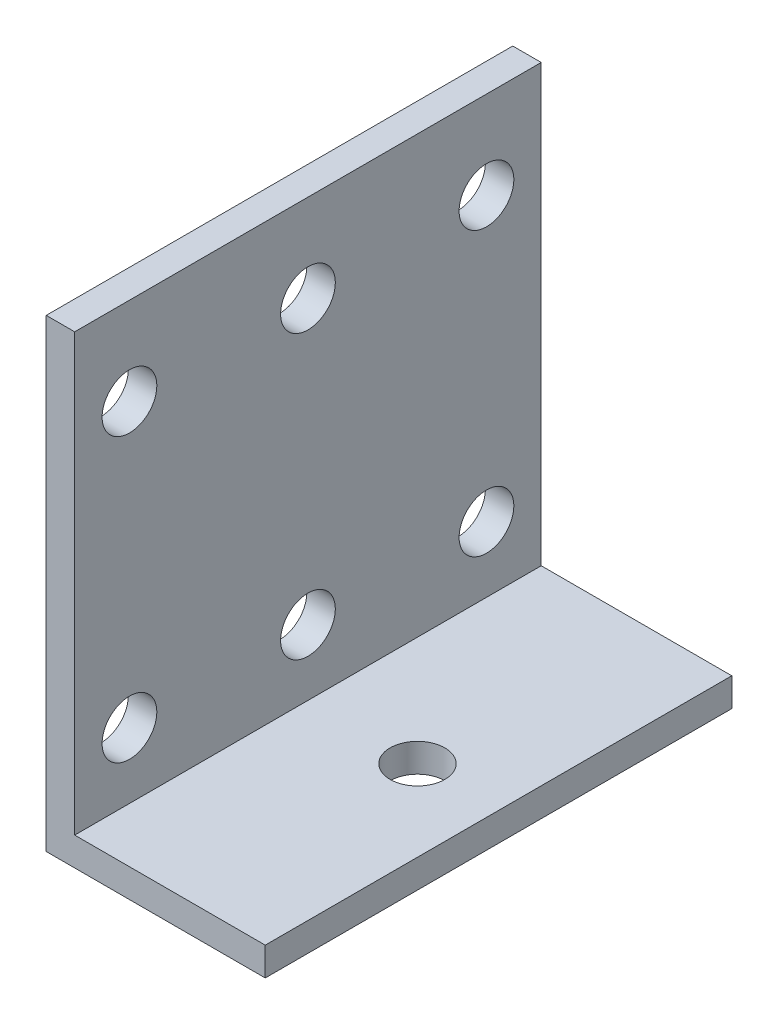
ISO-10303-21;
HEADER;
FILE_DESCRIPTION(('STEP AP214'),'2;1');
FILE_NAME('part.step','',(''),(''),'','','');
FILE_SCHEMA(('AUTOMOTIVE_DESIGN { 1 0 10303 214 1 1 1 1 }'));
ENDSEC;
DATA;
#1=APPLICATION_CONTEXT('core data for automotive mechanical design processes');
#2=APPLICATION_PROTOCOL_DEFINITION('international standard','automotive_design',2000,#1);
#3=PRODUCT_CONTEXT('',#1,'mechanical');
#4=PRODUCT('Part','Part','',(#3));
#5=PRODUCT_RELATED_PRODUCT_CATEGORY('part','',(#4));
#6=PRODUCT_DEFINITION_FORMATION('','',#4);
#7=PRODUCT_DEFINITION_CONTEXT('part definition',#1,'design');
#8=PRODUCT_DEFINITION('design','',#6,#7);
#9=PRODUCT_DEFINITION_SHAPE('','',#8);
#10=(LENGTH_UNIT() NAMED_UNIT(*) SI_UNIT(.MILLI.,.METRE.));
#11=(NAMED_UNIT(*) PLANE_ANGLE_UNIT() SI_UNIT($,.RADIAN.));
#12=(NAMED_UNIT(*) SI_UNIT($,.STERADIAN.) SOLID_ANGLE_UNIT());
#13=UNCERTAINTY_MEASURE_WITH_UNIT(LENGTH_MEASURE(1.E-05),#10,'distance_accuracy_value','');
#14=(GEOMETRIC_REPRESENTATION_CONTEXT(3) GLOBAL_UNCERTAINTY_ASSIGNED_CONTEXT((#13)) GLOBAL_UNIT_ASSIGNED_CONTEXT((#10,
#11,#12)) REPRESENTATION_CONTEXT('',''));
#15=CARTESIAN_POINT('',(0.,0.,0.));
#16=DIRECTION('',(0.,0.,1.));
#17=DIRECTION('',(1.,0.,0.));
#18=AXIS2_PLACEMENT_3D('',#15,#16,#17);
#19=CARTESIAN_POINT('',(12.7,3.302,27.051));
#20=DIRECTION('',(-1.,0.,0.));
#21=DIRECTION('',(0.,0.,1.));
#22=AXIS2_PLACEMENT_3D('',#19,#20,#21);
#23=PLANE('',#22);
#24=DIRECTION('',(0.,0.,-1.));
#25=VECTOR('',#24,1.);
#26=CARTESIAN_POINT('',(12.7,0.,27.051));
#27=LINE('',#26,#25);
#28=CARTESIAN_POINT('',(12.7,0.,27.051));
#29=VERTEX_POINT('',#28);
#30=CARTESIAN_POINT('',(12.7,0.,-27.051));
#31=VERTEX_POINT('',#30);
#32=EDGE_CURVE('E104',#29,#31,#27,.T.);
#33=ORIENTED_EDGE('',*,*,#32,.T.);
#34=DIRECTION('',(0.,-1.,0.));
#35=VECTOR('',#34,1.);
#36=CARTESIAN_POINT('',(12.7,3.302,-27.051));
#37=LINE('',#36,#35);
#38=CARTESIAN_POINT('',(12.7,3.302,-27.051));
#39=VERTEX_POINT('',#38);
#40=EDGE_CURVE('E11',#39,#31,#37,.T.);
#41=ORIENTED_EDGE('',*,*,#40,.F.);
#42=DIRECTION('',(0.,0.,-1.));
#43=VECTOR('',#42,1.);
#44=CARTESIAN_POINT('',(12.7,3.302,27.051));
#45=LINE('',#44,#43);
#46=CARTESIAN_POINT('',(12.7,3.302,27.051));
#47=VERTEX_POINT('',#46);
#48=EDGE_CURVE('E98',#47,#39,#45,.T.);
#49=ORIENTED_EDGE('',*,*,#48,.F.);
#50=DIRECTION('',(0.,-1.,0.));
#51=VECTOR('',#50,1.);
#52=CARTESIAN_POINT('',(12.7,3.302,27.051));
#53=LINE('',#52,#51);
#54=EDGE_CURVE('E89',#47,#29,#53,.T.);
#55=ORIENTED_EDGE('',*,*,#54,.T.);
#56=EDGE_LOOP('',(#33,#41,#49,#55));
#57=FACE_BOUND('',#56,.T.);
#58=ADVANCED_FACE('F43',(#57),#23,.F.);
#59=CARTESIAN_POINT('',(-12.7,3.302,-27.051));
#60=DIRECTION('',(0.,0.,1.));
#61=DIRECTION('',(1.,0.,0.));
#62=AXIS2_PLACEMENT_3D('',#59,#60,#61);
#63=PLANE('',#62);
#64=DIRECTION('',(-1.,0.,0.));
#65=VECTOR('',#64,1.);
#66=CARTESIAN_POINT('',(-12.7,0.,-27.051));
#67=LINE('',#66,#65);
#68=CARTESIAN_POINT('',(-12.7,0.,-27.051));
#69=VERTEX_POINT('',#68);
#70=EDGE_CURVE('E108',#31,#69,#67,.T.);
#71=ORIENTED_EDGE('',*,*,#70,.T.);
#72=DIRECTION('',(0.,-1.,0.));
#73=VECTOR('',#72,1.);
#74=CARTESIAN_POINT('',(-12.7,3.302,-27.051));
#75=LINE('',#74,#73);
#76=CARTESIAN_POINT('',(-12.7,53.848,-27.051));
#77=VERTEX_POINT('',#76);
#78=EDGE_CURVE('E51',#77,#69,#75,.T.);
#79=ORIENTED_EDGE('',*,*,#78,.F.);
#80=DIRECTION('',(1.,0.,0.));
#81=VECTOR('',#80,1.);
#82=CARTESIAN_POINT('',(-12.7,53.848,-27.051));
#83=LINE('',#82,#81);
#84=CARTESIAN_POINT('',(-9.398,53.848,-27.051));
#85=VERTEX_POINT('',#84);
#86=EDGE_CURVE('E136',#77,#85,#83,.T.);
#87=ORIENTED_EDGE('',*,*,#86,.T.);
#88=DIRECTION('',(0.,-1.,0.));
#89=VECTOR('',#88,1.);
#90=CARTESIAN_POINT('',(-9.398,53.848,-27.051));
#91=LINE('',#90,#89);
#92=CARTESIAN_POINT('',(-9.398,3.302,-27.051));
#93=VERTEX_POINT('',#92);
#94=EDGE_CURVE('E114',#85,#93,#91,.T.);
#95=ORIENTED_EDGE('',*,*,#94,.T.);
#96=DIRECTION('',(-1.,0.,0.));
#97=VECTOR('',#96,1.);
#98=CARTESIAN_POINT('',(-12.7,3.302,-27.051));
#99=LINE('',#98,#97);
#100=EDGE_CURVE('E169',#39,#93,#99,.T.);
#101=ORIENTED_EDGE('',*,*,#100,.F.);
#102=ORIENTED_EDGE('',*,*,#40,.T.);
#103=EDGE_LOOP('',(#71,#79,#87,#95,#101,#102));
#104=FACE_BOUND('',#103,.T.);
#105=ADVANCED_FACE('F133',(#104),#63,.F.);
#106=CARTESIAN_POINT('',(-12.7,3.302,27.051));
#107=DIRECTION('',(1.,0.,0.));
#108=DIRECTION('',(0.,0.,-1.));
#109=AXIS2_PLACEMENT_3D('',#106,#107,#108);
#110=PLANE('',#109);
#111=CARTESIAN_POINT('',(-12.7,43.6857297948952,20.701));
#112=DIRECTION('',(1.,0.,0.));
#113=DIRECTION('',(0.,0.,-1.));
#114=AXIS2_PLACEMENT_3D('',#111,#112,#113);
#115=CIRCLE('',#114,3.175);
#116=CARTESIAN_POINT('',(-12.7,43.6857297948952,17.526));
#117=VERTEX_POINT('',#116);
#118=EDGE_CURVE('E200',#117,#117,#115,.T.);
#119=ORIENTED_EDGE('',*,*,#118,.T.);
#120=EDGE_LOOP('',(#119));
#121=FACE_BOUND('',#120,.T.);
#122=CARTESIAN_POINT('',(-12.7,43.6857297948952,0.));
#123=DIRECTION('',(1.,0.,0.));
#124=DIRECTION('',(0.,0.,-1.));
#125=AXIS2_PLACEMENT_3D('',#122,#123,#124);
#126=CIRCLE('',#125,3.175);
#127=CARTESIAN_POINT('',(-12.7,43.6857297948952,-3.175));
#128=VERTEX_POINT('',#127);
#129=EDGE_CURVE('E204',#128,#128,#126,.T.);
#130=ORIENTED_EDGE('',*,*,#129,.T.);
#131=EDGE_LOOP('',(#130));
#132=FACE_BOUND('',#131,.T.);
#133=CARTESIAN_POINT('',(-12.7,43.6857297948952,-20.701));
#134=DIRECTION('',(1.,0.,0.));
#135=DIRECTION('',(0.,0.,-1.));
#136=AXIS2_PLACEMENT_3D('',#133,#134,#135);
#137=CIRCLE('',#136,3.175);
#138=CARTESIAN_POINT('',(-12.7,43.6857297948952,-23.876));
#139=VERTEX_POINT('',#138);
#140=EDGE_CURVE('E208',#139,#139,#137,.T.);
#141=ORIENTED_EDGE('',*,*,#140,.T.);
#142=EDGE_LOOP('',(#141));
#143=FACE_BOUND('',#142,.T.);
#144=CARTESIAN_POINT('',(-12.7,10.9094805306748,-20.701));
#145=DIRECTION('',(1.,0.,0.));
#146=DIRECTION('',(0.,0.,-1.));
#147=AXIS2_PLACEMENT_3D('',#144,#145,#146);
#148=CIRCLE('',#147,3.175);
#149=CARTESIAN_POINT('',(-12.7,10.9094805306748,-23.876));
#150=VERTEX_POINT('',#149);
#151=EDGE_CURVE('E212',#150,#150,#148,.T.);
#152=ORIENTED_EDGE('',*,*,#151,.T.);
#153=EDGE_LOOP('',(#152));
#154=FACE_BOUND('',#153,.T.);
#155=CARTESIAN_POINT('',(-12.7,10.9094805306748,0.));
#156=DIRECTION('',(1.,0.,0.));
#157=DIRECTION('',(0.,0.,-1.));
#158=AXIS2_PLACEMENT_3D('',#155,#156,#157);
#159=CIRCLE('',#158,3.175);
#160=CARTESIAN_POINT('',(-12.7,10.9094805306748,-3.175));
#161=VERTEX_POINT('',#160);
#162=EDGE_CURVE('E216',#161,#161,#159,.T.);
#163=ORIENTED_EDGE('',*,*,#162,.T.);
#164=EDGE_LOOP('',(#163));
#165=FACE_BOUND('',#164,.T.);
#166=CARTESIAN_POINT('',(-12.7,10.9094805306748,20.701));
#167=DIRECTION('',(1.,0.,0.));
#168=DIRECTION('',(0.,0.,-1.));
#169=AXIS2_PLACEMENT_3D('',#166,#167,#168);
#170=CIRCLE('',#169,3.175);
#171=CARTESIAN_POINT('',(-12.7,10.9094805306748,17.526));
#172=VERTEX_POINT('',#171);
#173=EDGE_CURVE('E164',#172,#172,#170,.T.);
#174=ORIENTED_EDGE('',*,*,#173,.T.);
#175=EDGE_LOOP('',(#174));
#176=FACE_BOUND('',#175,.T.);
#177=DIRECTION('',(0.,0.,1.));
#178=VECTOR('',#177,1.);
#179=CARTESIAN_POINT('',(-12.7,0.,27.051));
#180=LINE('',#179,#178);
#181=CARTESIAN_POINT('',(-12.7,0.,27.051));
#182=VERTEX_POINT('',#181);
#183=EDGE_CURVE('E99',#69,#182,#180,.T.);
#184=ORIENTED_EDGE('',*,*,#183,.T.);
#185=DIRECTION('',(0.,-1.,0.));
#186=VECTOR('',#185,1.);
#187=CARTESIAN_POINT('',(-12.7,3.302,27.051));
#188=LINE('',#187,#186);
#189=CARTESIAN_POINT('',(-12.7,53.848,27.051));
#190=VERTEX_POINT('',#189);
#191=EDGE_CURVE('E93',#190,#182,#188,.T.);
#192=ORIENTED_EDGE('',*,*,#191,.F.);
#193=DIRECTION('',(0.,0.,1.));
#194=VECTOR('',#193,1.);
#195=CARTESIAN_POINT('',(-12.7,53.848,-27.051));
#196=LINE('',#195,#194);
#197=EDGE_CURVE('E129',#77,#190,#196,.T.);
#198=ORIENTED_EDGE('',*,*,#197,.F.);
#199=ORIENTED_EDGE('',*,*,#78,.T.);
#200=EDGE_LOOP('',(#184,#192,#198,#199));
#201=FACE_BOUND('',#200,.T.);
#202=ADVANCED_FACE('F127',(#121,#132,#143,#154,#165,#176,#201),#110,.F.);
#203=CARTESIAN_POINT('',(-12.7,3.302,27.051));
#204=DIRECTION('',(0.,0.,-1.));
#205=DIRECTION('',(-1.,0.,0.));
#206=AXIS2_PLACEMENT_3D('',#203,#204,#205);
#207=PLANE('',#206);
#208=DIRECTION('',(1.,0.,0.));
#209=VECTOR('',#208,1.);
#210=CARTESIAN_POINT('',(-12.7,0.,27.051));
#211=LINE('',#210,#209);
#212=EDGE_CURVE('E86',#182,#29,#211,.T.);
#213=ORIENTED_EDGE('',*,*,#212,.T.);
#214=ORIENTED_EDGE('',*,*,#54,.F.);
#215=DIRECTION('',(1.,0.,0.));
#216=VECTOR('',#215,1.);
#217=CARTESIAN_POINT('',(-12.7,3.302,27.051));
#218=LINE('',#217,#216);
#219=CARTESIAN_POINT('',(-9.39799999999999,3.302,27.051));
#220=VERTEX_POINT('',#219);
#221=EDGE_CURVE('E66',#220,#47,#218,.T.);
#222=ORIENTED_EDGE('',*,*,#221,.F.);
#223=DIRECTION('',(0.,-1.,0.));
#224=VECTOR('',#223,1.);
#225=CARTESIAN_POINT('',(-9.39799999999999,53.848,27.051));
#226=LINE('',#225,#224);
#227=CARTESIAN_POINT('',(-9.39799999999999,53.848,27.051));
#228=VERTEX_POINT('',#227);
#229=EDGE_CURVE('E58',#228,#220,#226,.T.);
#230=ORIENTED_EDGE('',*,*,#229,.F.);
#231=DIRECTION('',(1.,0.,0.));
#232=VECTOR('',#231,1.);
#233=CARTESIAN_POINT('',(-12.7,53.848,27.051));
#234=LINE('',#233,#232);
#235=EDGE_CURVE('E148',#190,#228,#234,.T.);
#236=ORIENTED_EDGE('',*,*,#235,.F.);
#237=ORIENTED_EDGE('',*,*,#191,.T.);
#238=EDGE_LOOP('',(#213,#214,#222,#230,#236,#237));
#239=FACE_BOUND('',#238,.T.);
#240=ADVANCED_FACE('F88',(#239),#207,.F.);
#241=CARTESIAN_POINT('',(0.,3.302,0.));
#242=DIRECTION('',(0.,-1.,0.));
#243=DIRECTION('',(0.,0.,-1.));
#244=AXIS2_PLACEMENT_3D('',#241,#242,#243);
#245=PLANE('',#244);
#246=CARTESIAN_POINT('',(3.302,3.302,0.));
#247=DIRECTION('',(0.,1.,0.));
#248=DIRECTION('',(0.,0.,1.));
#249=AXIS2_PLACEMENT_3D('',#246,#247,#248);
#250=CIRCLE('',#249,3.175);
#251=CARTESIAN_POINT('',(3.302,3.302,3.175));
#252=VERTEX_POINT('',#251);
#253=EDGE_CURVE('E260',#252,#252,#250,.T.);
#254=ORIENTED_EDGE('',*,*,#253,.F.);
#255=EDGE_LOOP('',(#254));
#256=FACE_BOUND('',#255,.T.);
#257=ORIENTED_EDGE('',*,*,#100,.T.);
#258=DIRECTION('',(0.,0.,1.));
#259=VECTOR('',#258,1.);
#260=CARTESIAN_POINT('',(-9.398,3.302,-27.051));
#261=LINE('',#260,#259);
#262=EDGE_CURVE('E157',#93,#220,#261,.T.);
#263=ORIENTED_EDGE('',*,*,#262,.T.);
#264=ORIENTED_EDGE('',*,*,#221,.T.);
#265=ORIENTED_EDGE('',*,*,#48,.T.);
#266=EDGE_LOOP('',(#257,#263,#264,#265));
#267=FACE_BOUND('',#266,.T.);
#268=ADVANCED_FACE('F173',(#256,#267),#245,.F.);
#269=CARTESIAN_POINT('',(0.,0.,0.));
#270=DIRECTION('',(0.,-1.,0.));
#271=DIRECTION('',(0.,0.,-1.));
#272=AXIS2_PLACEMENT_3D('',#269,#270,#271);
#273=PLANE('',#272);
#274=CARTESIAN_POINT('',(3.302,0.,0.));
#275=DIRECTION('',(0.,1.,0.));
#276=DIRECTION('',(0.,0.,1.));
#277=AXIS2_PLACEMENT_3D('',#274,#275,#276);
#278=CIRCLE('',#277,3.175);
#279=CARTESIAN_POINT('',(3.302,0.,3.175));
#280=VERTEX_POINT('',#279);
#281=EDGE_CURVE('E256',#280,#280,#278,.T.);
#282=ORIENTED_EDGE('',*,*,#281,.T.);
#283=EDGE_LOOP('',(#282));
#284=FACE_BOUND('',#283,.T.);
#285=ORIENTED_EDGE('',*,*,#32,.F.);
#286=ORIENTED_EDGE('',*,*,#212,.F.);
#287=ORIENTED_EDGE('',*,*,#183,.F.);
#288=ORIENTED_EDGE('',*,*,#70,.F.);
#289=EDGE_LOOP('',(#285,#286,#287,#288));
#290=FACE_BOUND('',#289,.T.);
#291=ADVANCED_FACE('F107',(#284,#290),#273,.T.);
#292=CARTESIAN_POINT('',(-9.398,53.848,-27.051));
#293=DIRECTION('',(1.,0.,0.));
#294=DIRECTION('',(0.,0.,-1.));
#295=AXIS2_PLACEMENT_3D('',#292,#293,#294);
#296=PLANE('',#295);
#297=CARTESIAN_POINT('',(-9.39799999999999,43.6857297948952,20.701));
#298=DIRECTION('',(1.,0.,0.));
#299=DIRECTION('',(0.,0.,-1.));
#300=AXIS2_PLACEMENT_3D('',#297,#298,#299);
#301=CIRCLE('',#300,3.175);
#302=CARTESIAN_POINT('',(-9.39799999999999,43.6857297948952,17.526));
#303=VERTEX_POINT('',#302);
#304=EDGE_CURVE('E252',#303,#303,#301,.T.);
#305=ORIENTED_EDGE('',*,*,#304,.F.);
#306=EDGE_LOOP('',(#305));
#307=FACE_BOUND('',#306,.T.);
#308=CARTESIAN_POINT('',(-9.39799999999999,43.6857297948952,0.));
#309=DIRECTION('',(1.,0.,0.));
#310=DIRECTION('',(0.,0.,-1.));
#311=AXIS2_PLACEMENT_3D('',#308,#309,#310);
#312=CIRCLE('',#311,3.175);
#313=CARTESIAN_POINT('',(-9.39799999999999,43.6857297948952,-3.175));
#314=VERTEX_POINT('',#313);
#315=EDGE_CURVE('E246',#314,#314,#312,.T.);
#316=ORIENTED_EDGE('',*,*,#315,.F.);
#317=EDGE_LOOP('',(#316));
#318=FACE_BOUND('',#317,.T.);
#319=CARTESIAN_POINT('',(-9.398,43.6857297948952,-20.701));
#320=DIRECTION('',(1.,0.,0.));
#321=DIRECTION('',(0.,0.,-1.));
#322=AXIS2_PLACEMENT_3D('',#319,#320,#321);
#323=CIRCLE('',#322,3.175);
#324=CARTESIAN_POINT('',(-9.398,43.6857297948952,-23.876));
#325=VERTEX_POINT('',#324);
#326=EDGE_CURVE('E240',#325,#325,#323,.T.);
#327=ORIENTED_EDGE('',*,*,#326,.F.);
#328=EDGE_LOOP('',(#327));
#329=FACE_BOUND('',#328,.T.);
#330=CARTESIAN_POINT('',(-9.398,10.9094805306748,-20.701));
#331=DIRECTION('',(1.,0.,0.));
#332=DIRECTION('',(0.,0.,-1.));
#333=AXIS2_PLACEMENT_3D('',#330,#331,#332);
#334=CIRCLE('',#333,3.175);
#335=CARTESIAN_POINT('',(-9.398,10.9094805306748,-23.876));
#336=VERTEX_POINT('',#335);
#337=EDGE_CURVE('E234',#336,#336,#334,.T.);
#338=ORIENTED_EDGE('',*,*,#337,.F.);
#339=EDGE_LOOP('',(#338));
#340=FACE_BOUND('',#339,.T.);
#341=CARTESIAN_POINT('',(-9.39799999999999,10.9094805306748,0.));
#342=DIRECTION('',(1.,0.,0.));
#343=DIRECTION('',(0.,0.,-1.));
#344=AXIS2_PLACEMENT_3D('',#341,#342,#343);
#345=CIRCLE('',#344,3.175);
#346=CARTESIAN_POINT('',(-9.39799999999999,10.9094805306748,-3.17500000000001));
#347=VERTEX_POINT('',#346);
#348=EDGE_CURVE('E228',#347,#347,#345,.T.);
#349=ORIENTED_EDGE('',*,*,#348,.F.);
#350=EDGE_LOOP('',(#349));
#351=FACE_BOUND('',#350,.T.);
#352=CARTESIAN_POINT('',(-9.39799999999999,10.9094805306748,20.701));
#353=DIRECTION('',(1.,0.,0.));
#354=DIRECTION('',(0.,0.,-1.));
#355=AXIS2_PLACEMENT_3D('',#352,#353,#354);
#356=CIRCLE('',#355,3.175);
#357=CARTESIAN_POINT('',(-9.39799999999999,10.9094805306748,17.526));
#358=VERTEX_POINT('',#357);
#359=EDGE_CURVE('E221',#358,#358,#356,.T.);
#360=ORIENTED_EDGE('',*,*,#359,.F.);
#361=EDGE_LOOP('',(#360));
#362=FACE_BOUND('',#361,.T.);
#363=ORIENTED_EDGE('',*,*,#262,.F.);
#364=ORIENTED_EDGE('',*,*,#94,.F.);
#365=DIRECTION('',(0.,0.,1.));
#366=VECTOR('',#365,1.);
#367=CARTESIAN_POINT('',(-9.398,53.848,-27.051));
#368=LINE('',#367,#366);
#369=EDGE_CURVE('E150',#85,#228,#368,.T.);
#370=ORIENTED_EDGE('',*,*,#369,.T.);
#371=ORIENTED_EDGE('',*,*,#229,.T.);
#372=EDGE_LOOP('',(#363,#364,#370,#371));
#373=FACE_BOUND('',#372,.T.);
#374=ADVANCED_FACE('F153',(#307,#318,#329,#340,#351,#362,#373),#296,.T.);
#375=CARTESIAN_POINT('',(0.,53.848,0.));
#376=DIRECTION('',(0.,-1.,0.));
#377=DIRECTION('',(0.,0.,-1.));
#378=AXIS2_PLACEMENT_3D('',#375,#376,#377);
#379=PLANE('',#378);
#380=ORIENTED_EDGE('',*,*,#86,.F.);
#381=ORIENTED_EDGE('',*,*,#197,.T.);
#382=ORIENTED_EDGE('',*,*,#235,.T.);
#383=ORIENTED_EDGE('',*,*,#369,.F.);
#384=EDGE_LOOP('',(#380,#381,#382,#383));
#385=FACE_BOUND('',#384,.T.);
#386=ADVANCED_FACE('F149',(#385),#379,.F.);
#387=CARTESIAN_POINT('',(-9.39799999999999,10.9094805306748,20.701));
#388=DIRECTION('',(1.,0.,0.));
#389=DIRECTION('',(0.,0.,-1.));
#390=AXIS2_PLACEMENT_3D('',#387,#388,#389);
#391=CYLINDRICAL_SURFACE('',#390,3.175);
#392=ORIENTED_EDGE('',*,*,#173,.F.);
#393=EDGE_LOOP('',(#392));
#394=FACE_BOUND('',#393,.T.);
#395=ORIENTED_EDGE('',*,*,#359,.T.);
#396=EDGE_LOOP('',(#395));
#397=FACE_BOUND('',#396,.T.);
#398=ADVANCED_FACE('F291',(#394,#397),#391,.F.);
#399=CARTESIAN_POINT('',(-9.39799999999999,10.9094805306748,0.));
#400=DIRECTION('',(1.,0.,0.));
#401=DIRECTION('',(0.,0.,-1.));
#402=AXIS2_PLACEMENT_3D('',#399,#400,#401);
#403=CYLINDRICAL_SURFACE('',#402,3.175);
#404=ORIENTED_EDGE('',*,*,#162,.F.);
#405=EDGE_LOOP('',(#404));
#406=FACE_BOUND('',#405,.T.);
#407=ORIENTED_EDGE('',*,*,#348,.T.);
#408=EDGE_LOOP('',(#407));
#409=FACE_BOUND('',#408,.T.);
#410=ADVANCED_FACE('F287',(#406,#409),#403,.F.);
#411=CARTESIAN_POINT('',(-9.398,10.9094805306748,-20.701));
#412=DIRECTION('',(1.,0.,0.));
#413=DIRECTION('',(0.,0.,-1.));
#414=AXIS2_PLACEMENT_3D('',#411,#412,#413);
#415=CYLINDRICAL_SURFACE('',#414,3.175);
#416=ORIENTED_EDGE('',*,*,#151,.F.);
#417=EDGE_LOOP('',(#416));
#418=FACE_BOUND('',#417,.T.);
#419=ORIENTED_EDGE('',*,*,#337,.T.);
#420=EDGE_LOOP('',(#419));
#421=FACE_BOUND('',#420,.T.);
#422=ADVANCED_FACE('F283',(#418,#421),#415,.F.);
#423=CARTESIAN_POINT('',(-9.398,43.6857297948952,-20.701));
#424=DIRECTION('',(1.,0.,0.));
#425=DIRECTION('',(0.,0.,-1.));
#426=AXIS2_PLACEMENT_3D('',#423,#424,#425);
#427=CYLINDRICAL_SURFACE('',#426,3.175);
#428=ORIENTED_EDGE('',*,*,#140,.F.);
#429=EDGE_LOOP('',(#428));
#430=FACE_BOUND('',#429,.T.);
#431=ORIENTED_EDGE('',*,*,#326,.T.);
#432=EDGE_LOOP('',(#431));
#433=FACE_BOUND('',#432,.T.);
#434=ADVANCED_FACE('F279',(#430,#433),#427,.F.);
#435=CARTESIAN_POINT('',(-9.39799999999999,43.6857297948952,0.));
#436=DIRECTION('',(1.,0.,0.));
#437=DIRECTION('',(0.,0.,-1.));
#438=AXIS2_PLACEMENT_3D('',#435,#436,#437);
#439=CYLINDRICAL_SURFACE('',#438,3.175);
#440=ORIENTED_EDGE('',*,*,#129,.F.);
#441=EDGE_LOOP('',(#440));
#442=FACE_BOUND('',#441,.T.);
#443=ORIENTED_EDGE('',*,*,#315,.T.);
#444=EDGE_LOOP('',(#443));
#445=FACE_BOUND('',#444,.T.);
#446=ADVANCED_FACE('F272',(#442,#445),#439,.F.);
#447=CARTESIAN_POINT('',(-9.39799999999999,43.6857297948952,20.701));
#448=DIRECTION('',(1.,0.,0.));
#449=DIRECTION('',(0.,0.,-1.));
#450=AXIS2_PLACEMENT_3D('',#447,#448,#449);
#451=CYLINDRICAL_SURFACE('',#450,3.175);
#452=ORIENTED_EDGE('',*,*,#118,.F.);
#453=EDGE_LOOP('',(#452));
#454=FACE_BOUND('',#453,.T.);
#455=ORIENTED_EDGE('',*,*,#304,.T.);
#456=EDGE_LOOP('',(#455));
#457=FACE_BOUND('',#456,.T.);
#458=ADVANCED_FACE('F266',(#454,#457),#451,.F.);
#459=CARTESIAN_POINT('',(3.302,3.302,0.));
#460=DIRECTION('',(0.,1.,0.));
#461=DIRECTION('',(0.,0.,1.));
#462=AXIS2_PLACEMENT_3D('',#459,#460,#461);
#463=CYLINDRICAL_SURFACE('',#462,3.175);
#464=ORIENTED_EDGE('',*,*,#281,.F.);
#465=EDGE_LOOP('',(#464));
#466=FACE_BOUND('',#465,.T.);
#467=ORIENTED_EDGE('',*,*,#253,.T.);
#468=EDGE_LOOP('',(#467));
#469=FACE_BOUND('',#468,.T.);
#470=ADVANCED_FACE('F264',(#466,#469),#463,.F.);
#471=CLOSED_SHELL('',(#58,#105,#202,#240,#268,#291,#374,#386,#398,#410,#422,#434,#446,#458,#470));
#472=MANIFOLD_SOLID_BREP('B2',#471);
#473=ADVANCED_BREP_SHAPE_REPRESENTATION('',(#18,#472),#14);
#474=SHAPE_DEFINITION_REPRESENTATION(#9,#473);
ENDSEC;
END-ISO-10303-21;
